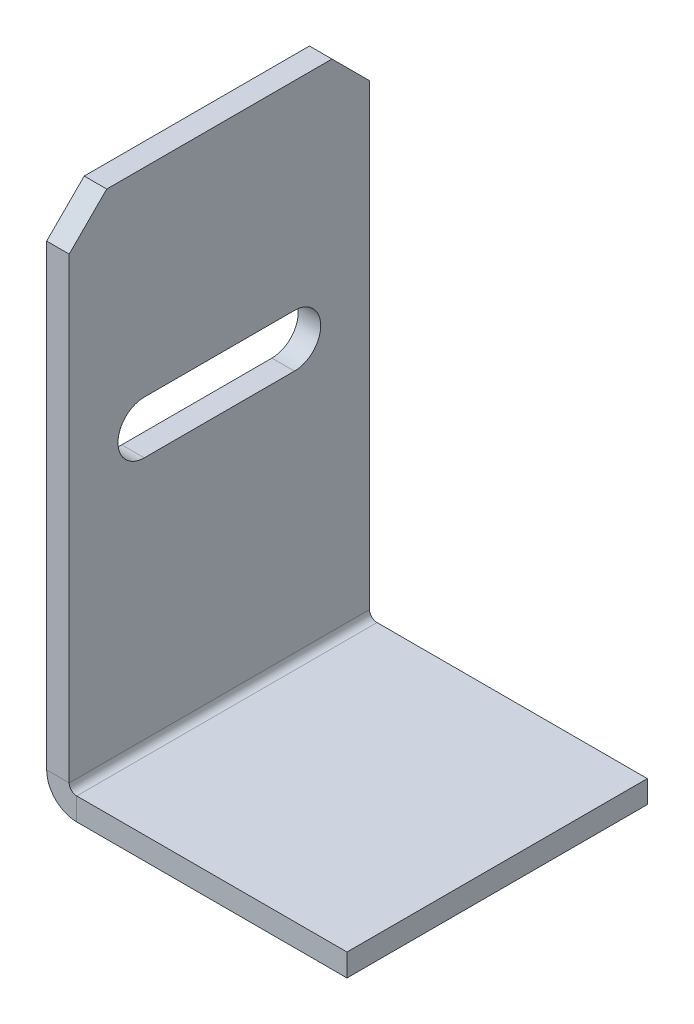
ISO-10303-21;
HEADER;
FILE_DESCRIPTION(('STEP AP214'),'2;1');
FILE_NAME('part.step','',(''),(''),'','','');
FILE_SCHEMA(('AUTOMOTIVE_DESIGN { 1 0 10303 214 1 1 1 1 }'));
ENDSEC;
DATA;
#1=APPLICATION_CONTEXT('core data for automotive mechanical design processes');
#2=APPLICATION_PROTOCOL_DEFINITION('international standard','automotive_design',2000,#1);
#3=PRODUCT_CONTEXT('',#1,'mechanical');
#4=PRODUCT('Part','Part','',(#3));
#5=PRODUCT_RELATED_PRODUCT_CATEGORY('part','',(#4));
#6=PRODUCT_DEFINITION_FORMATION('','',#4);
#7=PRODUCT_DEFINITION_CONTEXT('part definition',#1,'design');
#8=PRODUCT_DEFINITION('design','',#6,#7);
#9=PRODUCT_DEFINITION_SHAPE('','',#8);
#10=(LENGTH_UNIT() NAMED_UNIT(*) SI_UNIT(.MILLI.,.METRE.));
#11=(NAMED_UNIT(*) PLANE_ANGLE_UNIT() SI_UNIT($,.RADIAN.));
#12=(NAMED_UNIT(*) SI_UNIT($,.STERADIAN.) SOLID_ANGLE_UNIT());
#13=UNCERTAINTY_MEASURE_WITH_UNIT(LENGTH_MEASURE(1.E-05),#10,'distance_accuracy_value','');
#14=(GEOMETRIC_REPRESENTATION_CONTEXT(3) GLOBAL_UNCERTAINTY_ASSIGNED_CONTEXT((#13)) GLOBAL_UNIT_ASSIGNED_CONTEXT((#10,
#11,#12)) REPRESENTATION_CONTEXT('',''));
#15=CARTESIAN_POINT('',(0.,0.,0.));
#16=DIRECTION('',(0.,0.,1.));
#17=DIRECTION('',(1.,0.,0.));
#18=AXIS2_PLACEMENT_3D('',#15,#16,#17);
#19=CARTESIAN_POINT('',(0.,0.,40.));
#20=DIRECTION('',(0.,1.,0.));
#21=DIRECTION('',(0.,0.,1.));
#22=AXIS2_PLACEMENT_3D('',#19,#20,#21);
#23=PLANE('',#22);
#24=DIRECTION('',(0.,0.,1.));
#25=VECTOR('',#24,1.);
#26=CARTESIAN_POINT('',(40.,0.,40.));
#27=LINE('',#26,#25);
#28=CARTESIAN_POINT('',(40.,0.,40.));
#29=VERTEX_POINT('',#28);
#30=CARTESIAN_POINT('',(40.,0.,0.));
#31=VERTEX_POINT('',#30);
#32=EDGE_CURVE('E204',#29,#31,#27,.F.);
#33=ORIENTED_EDGE('',*,*,#32,.F.);
#34=DIRECTION('',(1.,0.,0.));
#35=VECTOR('',#34,1.);
#36=CARTESIAN_POINT('',(0.,0.,40.));
#37=LINE('',#36,#35);
#38=CARTESIAN_POINT('',(4.,0.,40.));
#39=VERTEX_POINT('',#38);
#40=EDGE_CURVE('E187',#39,#29,#37,.T.);
#41=ORIENTED_EDGE('',*,*,#40,.F.);
#42=DIRECTION('',(0.,0.,-1.));
#43=VECTOR('',#42,1.);
#44=CARTESIAN_POINT('',(4.,0.,40.));
#45=LINE('',#44,#43);
#46=CARTESIAN_POINT('',(4.,0.,0.));
#47=VERTEX_POINT('',#46);
#48=EDGE_CURVE('E201',#47,#39,#45,.F.);
#49=ORIENTED_EDGE('',*,*,#48,.F.);
#50=DIRECTION('',(1.,0.,0.));
#51=VECTOR('',#50,1.);
#52=CARTESIAN_POINT('',(0.,0.,0.));
#53=LINE('',#52,#51);
#54=EDGE_CURVE('E215',#31,#47,#53,.F.);
#55=ORIENTED_EDGE('',*,*,#54,.F.);
#56=EDGE_LOOP('',(#33,#41,#49,#55));
#57=FACE_BOUND('',#56,.T.);
#58=ADVANCED_FACE('F55',(#57),#23,.F.);
#59=CARTESIAN_POINT('',(4.,110.62899237659,40.));
#60=DIRECTION('',(0.,0.,1.));
#61=DIRECTION('',(0.,1.,0.));
#62=AXIS2_PLACEMENT_3D('',#59,#60,#61);
#63=PLANE('',#62);
#64=ORIENTED_EDGE('',*,*,#40,.T.);
#65=DIRECTION('',(0.,-1.,0.));
#66=VECTOR('',#65,1.);
#67=CARTESIAN_POINT('',(40.,110.62899237659,40.));
#68=LINE('',#67,#66);
#69=CARTESIAN_POINT('',(40.,3.,40.));
#70=VERTEX_POINT('',#69);
#71=EDGE_CURVE('E12',#70,#29,#68,.T.);
#72=ORIENTED_EDGE('',*,*,#71,.F.);
#73=DIRECTION('',(1.,0.,0.));
#74=VECTOR('',#73,1.);
#75=CARTESIAN_POINT('',(4.,3.,40.));
#76=LINE('',#75,#74);
#77=CARTESIAN_POINT('',(4.,3.,40.));
#78=VERTEX_POINT('',#77);
#79=EDGE_CURVE('E189',#70,#78,#76,.F.);
#80=ORIENTED_EDGE('',*,*,#79,.T.);
#81=DIRECTION('',(0.,-1.,0.));
#82=VECTOR('',#81,1.);
#83=CARTESIAN_POINT('',(4.,110.62899237659,40.));
#84=LINE('',#83,#82);
#85=EDGE_CURVE('E185',#78,#39,#84,.T.);
#86=ORIENTED_EDGE('',*,*,#85,.T.);
#87=EDGE_LOOP('',(#64,#72,#80,#86));
#88=FACE_BOUND('',#87,.T.);
#89=ADVANCED_FACE('F57',(#88),#63,.T.);
#90=CARTESIAN_POINT('',(40.,110.62899237659,40.));
#91=DIRECTION('',(1.,0.,0.));
#92=DIRECTION('',(0.,1.,0.));
#93=AXIS2_PLACEMENT_3D('',#90,#91,#92);
#94=PLANE('',#93);
#95=ORIENTED_EDGE('',*,*,#32,.T.);
#96=DIRECTION('',(0.,-1.,0.));
#97=VECTOR('',#96,1.);
#98=CARTESIAN_POINT('',(40.,110.62899237659,0.));
#99=LINE('',#98,#97);
#100=CARTESIAN_POINT('',(40.,3.,0.));
#101=VERTEX_POINT('',#100);
#102=EDGE_CURVE('E64',#101,#31,#99,.T.);
#103=ORIENTED_EDGE('',*,*,#102,.F.);
#104=DIRECTION('',(0.,0.,-1.));
#105=VECTOR('',#104,1.);
#106=CARTESIAN_POINT('',(40.,3.,40.));
#107=LINE('',#106,#105);
#108=EDGE_CURVE('E74',#101,#70,#107,.F.);
#109=ORIENTED_EDGE('',*,*,#108,.T.);
#110=ORIENTED_EDGE('',*,*,#71,.T.);
#111=EDGE_LOOP('',(#95,#103,#109,#110));
#112=FACE_BOUND('',#111,.T.);
#113=ADVANCED_FACE('F265',(#112),#94,.T.);
#114=CARTESIAN_POINT('',(3.,110.62899237659,0.));
#115=DIRECTION('',(0.,0.,-1.));
#116=DIRECTION('',(0.,-1.,0.));
#117=AXIS2_PLACEMENT_3D('',#114,#115,#116);
#118=PLANE('',#117);
#119=ORIENTED_EDGE('',*,*,#54,.T.);
#120=DIRECTION('',(0.,-1.,0.));
#121=VECTOR('',#120,1.);
#122=CARTESIAN_POINT('',(4.,110.62899237659,0.));
#123=LINE('',#122,#121);
#124=CARTESIAN_POINT('',(4.,3.,0.));
#125=VERTEX_POINT('',#124);
#126=EDGE_CURVE('E195',#125,#47,#123,.T.);
#127=ORIENTED_EDGE('',*,*,#126,.F.);
#128=DIRECTION('',(-1.,0.,0.));
#129=VECTOR('',#128,1.);
#130=CARTESIAN_POINT('',(3.,3.,0.));
#131=LINE('',#130,#129);
#132=EDGE_CURVE('E84',#125,#101,#131,.F.);
#133=ORIENTED_EDGE('',*,*,#132,.T.);
#134=ORIENTED_EDGE('',*,*,#102,.T.);
#135=EDGE_LOOP('',(#119,#127,#133,#134));
#136=FACE_BOUND('',#135,.T.);
#137=ADVANCED_FACE('F264',(#136),#118,.T.);
#138=CARTESIAN_POINT('',(0.,3.,40.));
#139=DIRECTION('',(0.,1.,0.));
#140=DIRECTION('',(0.,0.,1.));
#141=AXIS2_PLACEMENT_3D('',#138,#139,#140);
#142=PLANE('',#141);
#143=ORIENTED_EDGE('',*,*,#79,.F.);
#144=ORIENTED_EDGE('',*,*,#108,.F.);
#145=ORIENTED_EDGE('',*,*,#132,.F.);
#146=DIRECTION('',(0.,0.,-1.));
#147=VECTOR('',#146,1.);
#148=CARTESIAN_POINT('',(4.,3.,40.));
#149=LINE('',#148,#147);
#150=EDGE_CURVE('E196',#125,#78,#149,.F.);
#151=ORIENTED_EDGE('',*,*,#150,.T.);
#152=EDGE_LOOP('',(#143,#144,#145,#151));
#153=FACE_BOUND('',#152,.T.);
#154=ADVANCED_FACE('F267',(#153),#142,.T.);
#155=CARTESIAN_POINT('',(-0.00100000000000013,43.5,30.));
#156=DIRECTION('',(0.,1.,0.));
#157=DIRECTION('',(0.,0.,1.));
#158=AXIS2_PLACEMENT_3D('',#155,#156,#157);
#159=PLANE('',#158);
#160=DIRECTION('',(1.,0.,0.));
#161=VECTOR('',#160,1.);
#162=CARTESIAN_POINT('',(-0.00100000000000013,43.5,10.));
#163=LINE('',#162,#161);
#164=CARTESIAN_POINT('',(3.,43.5,9.99999999999999));
#165=VERTEX_POINT('',#164);
#166=CARTESIAN_POINT('',(0.,43.5,10.));
#167=VERTEX_POINT('',#166);
#168=EDGE_CURVE('E327',#165,#167,#163,.F.);
#169=ORIENTED_EDGE('',*,*,#168,.F.);
#170=DIRECTION('',(0.,0.,1.));
#171=VECTOR('',#170,1.);
#172=CARTESIAN_POINT('',(3.,43.5,30.));
#173=LINE('',#172,#171);
#174=CARTESIAN_POINT('',(3.,43.5,30.));
#175=VERTEX_POINT('',#174);
#176=EDGE_CURVE('E283',#175,#165,#173,.F.);
#177=ORIENTED_EDGE('',*,*,#176,.F.);
#178=DIRECTION('',(1.,0.,0.));
#179=VECTOR('',#178,1.);
#180=CARTESIAN_POINT('',(-0.00100000000000013,43.5,30.));
#181=LINE('',#180,#179);
#182=CARTESIAN_POINT('',(0.,43.5,30.));
#183=VERTEX_POINT('',#182);
#184=EDGE_CURVE('E348',#183,#175,#181,.T.);
#185=ORIENTED_EDGE('',*,*,#184,.F.);
#186=DIRECTION('',(0.,0.,-1.));
#187=VECTOR('',#186,1.);
#188=CARTESIAN_POINT('',(0.,43.5,40.));
#189=LINE('',#188,#187);
#190=EDGE_CURVE('E241',#183,#167,#189,.T.);
#191=ORIENTED_EDGE('',*,*,#190,.T.);
#192=EDGE_LOOP('',(#169,#177,#185,#191));
#193=FACE_BOUND('',#192,.T.);
#194=ADVANCED_FACE('F359',(#193),#159,.F.);
#195=CARTESIAN_POINT('',(-0.00100000000000013,40.,30.));
#196=DIRECTION('',(1.,0.,0.));
#197=DIRECTION('',(0.,0.,-1.));
#198=AXIS2_PLACEMENT_3D('',#195,#196,#197);
#199=CYLINDRICAL_SURFACE('',#198,3.5);
#200=ORIENTED_EDGE('',*,*,#184,.T.);
#201=CARTESIAN_POINT('',(3.,40.,30.));
#202=DIRECTION('',(1.,0.,0.));
#203=DIRECTION('',(0.,0.,-1.));
#204=AXIS2_PLACEMENT_3D('',#201,#202,#203);
#205=CIRCLE('',#204,3.5);
#206=CARTESIAN_POINT('',(3.,36.5,30.));
#207=VERTEX_POINT('',#206);
#208=EDGE_CURVE('E291',#207,#175,#205,.F.);
#209=ORIENTED_EDGE('',*,*,#208,.F.);
#210=DIRECTION('',(1.,0.,0.));
#211=VECTOR('',#210,1.);
#212=CARTESIAN_POINT('',(-0.00100000000000013,36.5,30.));
#213=LINE('',#212,#211);
#214=CARTESIAN_POINT('',(0.,36.5,30.));
#215=VERTEX_POINT('',#214);
#216=EDGE_CURVE('E342',#215,#207,#213,.T.);
#217=ORIENTED_EDGE('',*,*,#216,.F.);
#218=CARTESIAN_POINT('',(0.,40.,30.));
#219=DIRECTION('',(1.,0.,0.));
#220=DIRECTION('',(0.,0.,-1.));
#221=AXIS2_PLACEMENT_3D('',#218,#219,#220);
#222=CIRCLE('',#221,3.5);
#223=EDGE_CURVE('E346',#215,#183,#222,.F.);
#224=ORIENTED_EDGE('',*,*,#223,.T.);
#225=EDGE_LOOP('',(#200,#209,#217,#224));
#226=FACE_BOUND('',#225,.T.);
#227=ADVANCED_FACE('F372',(#226),#199,.F.);
#228=CARTESIAN_POINT('',(-0.00100000000000013,36.5,30.));
#229=DIRECTION('',(0.,-1.,0.));
#230=DIRECTION('',(0.,0.,-1.));
#231=AXIS2_PLACEMENT_3D('',#228,#229,#230);
#232=PLANE('',#231);
#233=ORIENTED_EDGE('',*,*,#216,.T.);
#234=DIRECTION('',(0.,0.,-1.));
#235=VECTOR('',#234,1.);
#236=CARTESIAN_POINT('',(3.,36.5,30.));
#237=LINE('',#236,#235);
#238=CARTESIAN_POINT('',(3.,36.5,9.99999999999999));
#239=VERTEX_POINT('',#238);
#240=EDGE_CURVE('E298',#239,#207,#237,.F.);
#241=ORIENTED_EDGE('',*,*,#240,.F.);
#242=DIRECTION('',(1.,0.,0.));
#243=VECTOR('',#242,1.);
#244=CARTESIAN_POINT('',(-0.00100000000000013,36.5,9.99999999999999));
#245=LINE('',#244,#243);
#246=CARTESIAN_POINT('',(0.,36.5,9.99999999999999));
#247=VERTEX_POINT('',#246);
#248=EDGE_CURVE('E331',#247,#239,#245,.T.);
#249=ORIENTED_EDGE('',*,*,#248,.F.);
#250=DIRECTION('',(0.,0.,-1.));
#251=VECTOR('',#250,1.);
#252=CARTESIAN_POINT('',(0.,36.5,40.));
#253=LINE('',#252,#251);
#254=EDGE_CURVE('E338',#247,#215,#253,.F.);
#255=ORIENTED_EDGE('',*,*,#254,.T.);
#256=EDGE_LOOP('',(#233,#241,#249,#255));
#257=FACE_BOUND('',#256,.T.);
#258=ADVANCED_FACE('F374',(#257),#232,.F.);
#259=CARTESIAN_POINT('',(-0.00100000000000013,40.,9.99999999999999));
#260=DIRECTION('',(1.,0.,0.));
#261=DIRECTION('',(0.,0.,-1.));
#262=AXIS2_PLACEMENT_3D('',#259,#260,#261);
#263=CYLINDRICAL_SURFACE('',#262,3.5);
#264=CARTESIAN_POINT('',(0.,40.,9.99999999999999));
#265=DIRECTION('',(1.,0.,0.));
#266=DIRECTION('',(0.,0.,-1.));
#267=AXIS2_PLACEMENT_3D('',#264,#265,#266);
#268=CIRCLE('',#267,3.5);
#269=EDGE_CURVE('E335',#167,#247,#268,.F.);
#270=ORIENTED_EDGE('',*,*,#269,.T.);
#271=ORIENTED_EDGE('',*,*,#248,.T.);
#272=CARTESIAN_POINT('',(3.,40.,9.99999999999999));
#273=DIRECTION('',(1.,0.,0.));
#274=DIRECTION('',(0.,0.,-1.));
#275=AXIS2_PLACEMENT_3D('',#272,#273,#274);
#276=CIRCLE('',#275,3.5);
#277=EDGE_CURVE('E301',#165,#239,#276,.F.);
#278=ORIENTED_EDGE('',*,*,#277,.F.);
#279=ORIENTED_EDGE('',*,*,#168,.T.);
#280=EDGE_LOOP('',(#270,#271,#278,#279));
#281=FACE_BOUND('',#280,.T.);
#282=ADVANCED_FACE('F367',(#281),#263,.F.);
#283=CARTESIAN_POINT('',(157.350251052598,70.,35.));
#284=DIRECTION('',(0.,-0.707106781186546,-0.707106781186549));
#285=DIRECTION('',(0.,0.707106781186549,-0.707106781186546));
#286=AXIS2_PLACEMENT_3D('',#283,#284,#285);
#287=PLANE('',#286);
#288=DIRECTION('',(-1.,0.,0.));
#289=VECTOR('',#288,1.);
#290=CARTESIAN_POINT('',(157.350251052598,70.,35.));
#291=LINE('',#290,#289);
#292=CARTESIAN_POINT('',(3.,70.,35.));
#293=VERTEX_POINT('',#292);
#294=CARTESIAN_POINT('',(0.,70.,35.));
#295=VERTEX_POINT('',#294);
#296=EDGE_CURVE('E322',#293,#295,#291,.T.);
#297=ORIENTED_EDGE('',*,*,#296,.T.);
#298=DIRECTION('',(0.,-0.707106781186549,0.707106781186545));
#299=VECTOR('',#298,1.);
#300=CARTESIAN_POINT('',(0.,70.,35.));
#301=LINE('',#300,#299);
#302=CARTESIAN_POINT('',(0.,65.,40.));
#303=VERTEX_POINT('',#302);
#304=EDGE_CURVE('E315',#295,#303,#301,.T.);
#305=ORIENTED_EDGE('',*,*,#304,.T.);
#306=DIRECTION('',(-1.,0.,0.));
#307=VECTOR('',#306,1.);
#308=CARTESIAN_POINT('',(157.350251052598,65.,40.));
#309=LINE('',#308,#307);
#310=CARTESIAN_POINT('',(3.,65.,40.));
#311=VERTEX_POINT('',#310);
#312=EDGE_CURVE('E247',#311,#303,#309,.T.);
#313=ORIENTED_EDGE('',*,*,#312,.F.);
#314=DIRECTION('',(0.,0.707106781186549,-0.707106781186546));
#315=VECTOR('',#314,1.);
#316=CARTESIAN_POINT('',(3.,70.,35.));
#317=LINE('',#316,#315);
#318=EDGE_CURVE('E309',#293,#311,#317,.F.);
#319=ORIENTED_EDGE('',*,*,#318,.F.);
#320=EDGE_LOOP('',(#297,#305,#313,#319));
#321=FACE_BOUND('',#320,.T.);
#322=ADVANCED_FACE('F381',(#321),#287,.F.);
#323=CARTESIAN_POINT('',(157.350251052598,70.,40.));
#324=DIRECTION('',(0.,1.,0.));
#325=DIRECTION('',(0.,0.,1.));
#326=AXIS2_PLACEMENT_3D('',#323,#324,#325);
#327=PLANE('',#326);
#328=DIRECTION('',(0.,0.,-1.));
#329=VECTOR('',#328,1.);
#330=CARTESIAN_POINT('',(0.,70.,40.));
#331=LINE('',#330,#329);
#332=CARTESIAN_POINT('',(0.,70.,5.));
#333=VERTEX_POINT('',#332);
#334=EDGE_CURVE('E321',#333,#295,#331,.F.);
#335=ORIENTED_EDGE('',*,*,#334,.T.);
#336=ORIENTED_EDGE('',*,*,#296,.F.);
#337=DIRECTION('',(0.,0.,1.));
#338=VECTOR('',#337,1.);
#339=CARTESIAN_POINT('',(3.,70.,40.));
#340=LINE('',#339,#338);
#341=CARTESIAN_POINT('',(3.,70.,5.));
#342=VERTEX_POINT('',#341);
#343=EDGE_CURVE('E638',#293,#342,#340,.F.);
#344=ORIENTED_EDGE('',*,*,#343,.T.);
#345=DIRECTION('',(-1.,0.,0.));
#346=VECTOR('',#345,1.);
#347=CARTESIAN_POINT('',(157.350251052598,70.,5.));
#348=LINE('',#347,#346);
#349=EDGE_CURVE('E634',#342,#333,#348,.T.);
#350=ORIENTED_EDGE('',*,*,#349,.T.);
#351=EDGE_LOOP('',(#335,#336,#344,#350));
#352=FACE_BOUND('',#351,.T.);
#353=ADVANCED_FACE('F446',(#352),#327,.T.);
#354=CARTESIAN_POINT('',(157.350251052598,65.,0.));
#355=DIRECTION('',(0.,0.707106781186549,-0.707106781186546));
#356=DIRECTION('',(0.,0.707106781186546,0.707106781186549));
#357=AXIS2_PLACEMENT_3D('',#354,#355,#356);
#358=PLANE('',#357);
#359=DIRECTION('',(0.,0.707106781186546,0.707106781186548));
#360=VECTOR('',#359,1.);
#361=CARTESIAN_POINT('',(0.,65.,0.));
#362=LINE('',#361,#360);
#363=CARTESIAN_POINT('',(0.,65.,0.));
#364=VERTEX_POINT('',#363);
#365=EDGE_CURVE('E627',#364,#333,#362,.T.);
#366=ORIENTED_EDGE('',*,*,#365,.T.);
#367=ORIENTED_EDGE('',*,*,#349,.F.);
#368=DIRECTION('',(0.,0.707106781186546,0.707106781186549));
#369=VECTOR('',#368,1.);
#370=CARTESIAN_POINT('',(3.,65.,0.));
#371=LINE('',#370,#369);
#372=CARTESIAN_POINT('',(3.,65.,0.));
#373=VERTEX_POINT('',#372);
#374=EDGE_CURVE('E633',#342,#373,#371,.F.);
#375=ORIENTED_EDGE('',*,*,#374,.T.);
#376=DIRECTION('',(-1.,0.,0.));
#377=VECTOR('',#376,1.);
#378=CARTESIAN_POINT('',(157.350251052598,65.,0.));
#379=LINE('',#378,#377);
#380=EDGE_CURVE('E651',#373,#364,#379,.T.);
#381=ORIENTED_EDGE('',*,*,#380,.T.);
#382=EDGE_LOOP('',(#366,#367,#375,#381));
#383=FACE_BOUND('',#382,.T.);
#384=ADVANCED_FACE('F456',(#383),#358,.T.);
#385=CARTESIAN_POINT('',(3.,0.,40.));
#386=DIRECTION('',(1.,0.,0.));
#387=DIRECTION('',(0.,0.,-1.));
#388=AXIS2_PLACEMENT_3D('',#385,#386,#387);
#389=PLANE('',#388);
#390=DIRECTION('',(0.,1.,0.));
#391=VECTOR('',#390,1.);
#392=CARTESIAN_POINT('',(3.,4.,0.));
#393=LINE('',#392,#391);
#394=CARTESIAN_POINT('',(3.,4.,0.));
#395=VERTEX_POINT('',#394);
#396=EDGE_CURVE('E647',#395,#373,#393,.T.);
#397=ORIENTED_EDGE('',*,*,#396,.T.);
#398=ORIENTED_EDGE('',*,*,#374,.F.);
#399=ORIENTED_EDGE('',*,*,#343,.F.);
#400=ORIENTED_EDGE('',*,*,#318,.T.);
#401=DIRECTION('',(0.,1.,0.));
#402=VECTOR('',#401,1.);
#403=CARTESIAN_POINT('',(3.,3.,40.));
#404=LINE('',#403,#402);
#405=CARTESIAN_POINT('',(3.,4.,40.));
#406=VERTEX_POINT('',#405);
#407=EDGE_CURVE('E619',#406,#311,#404,.T.);
#408=ORIENTED_EDGE('',*,*,#407,.F.);
#409=DIRECTION('',(0.,0.,-1.));
#410=VECTOR('',#409,1.);
#411=CARTESIAN_POINT('',(3.,4.,40.));
#412=LINE('',#411,#410);
#413=EDGE_CURVE('E304',#406,#395,#412,.T.);
#414=ORIENTED_EDGE('',*,*,#413,.T.);
#415=EDGE_LOOP('',(#397,#398,#399,#400,#408,#414));
#416=FACE_BOUND('',#415,.T.);
#417=ORIENTED_EDGE('',*,*,#277,.T.);
#418=ORIENTED_EDGE('',*,*,#240,.T.);
#419=ORIENTED_EDGE('',*,*,#208,.T.);
#420=ORIENTED_EDGE('',*,*,#176,.T.);
#421=EDGE_LOOP('',(#417,#418,#419,#420));
#422=FACE_BOUND('',#421,.T.);
#423=ADVANCED_FACE('F370',(#416,#422),#389,.T.);
#424=CARTESIAN_POINT('',(157.350251052598,4.,0.));
#425=DIRECTION('',(0.,0.,1.));
#426=DIRECTION('',(1.,0.,0.));
#427=AXIS2_PLACEMENT_3D('',#424,#425,#426);
#428=PLANE('',#427);
#429=DIRECTION('',(-1.,0.,0.));
#430=VECTOR('',#429,1.);
#431=CARTESIAN_POINT('',(157.350251052598,4.,0.));
#432=LINE('',#431,#430);
#433=CARTESIAN_POINT('',(0.,4.,0.));
#434=VERTEX_POINT('',#433);
#435=EDGE_CURVE('E277',#395,#434,#432,.T.);
#436=ORIENTED_EDGE('',*,*,#435,.T.);
#437=DIRECTION('',(0.,1.,0.));
#438=VECTOR('',#437,1.);
#439=CARTESIAN_POINT('',(0.,0.,0.));
#440=LINE('',#439,#438);
#441=EDGE_CURVE('E282',#434,#364,#440,.T.);
#442=ORIENTED_EDGE('',*,*,#441,.T.);
#443=ORIENTED_EDGE('',*,*,#380,.F.);
#444=ORIENTED_EDGE('',*,*,#396,.F.);
#445=EDGE_LOOP('',(#436,#442,#443,#444));
#446=FACE_BOUND('',#445,.T.);
#447=ADVANCED_FACE('F475',(#446),#428,.F.);
#448=CARTESIAN_POINT('',(0.,0.,40.));
#449=DIRECTION('',(1.,0.,0.));
#450=DIRECTION('',(0.,0.,-1.));
#451=AXIS2_PLACEMENT_3D('',#448,#449,#450);
#452=PLANE('',#451);
#453=ORIENTED_EDGE('',*,*,#304,.F.);
#454=ORIENTED_EDGE('',*,*,#334,.F.);
#455=ORIENTED_EDGE('',*,*,#365,.F.);
#456=ORIENTED_EDGE('',*,*,#441,.F.);
#457=DIRECTION('',(0.,0.,-1.));
#458=VECTOR('',#457,1.);
#459=CARTESIAN_POINT('',(0.,4.,40.));
#460=LINE('',#459,#458);
#461=CARTESIAN_POINT('',(0.,4.,40.));
#462=VERTEX_POINT('',#461);
#463=EDGE_CURVE('E236',#462,#434,#460,.T.);
#464=ORIENTED_EDGE('',*,*,#463,.F.);
#465=DIRECTION('',(0.,1.,0.));
#466=VECTOR('',#465,1.);
#467=CARTESIAN_POINT('',(0.,0.,40.));
#468=LINE('',#467,#466);
#469=EDGE_CURVE('E288',#303,#462,#468,.F.);
#470=ORIENTED_EDGE('',*,*,#469,.F.);
#471=EDGE_LOOP('',(#453,#454,#455,#456,#464,#470));
#472=FACE_BOUND('',#471,.T.);
#473=ORIENTED_EDGE('',*,*,#223,.F.);
#474=ORIENTED_EDGE('',*,*,#254,.F.);
#475=ORIENTED_EDGE('',*,*,#269,.F.);
#476=ORIENTED_EDGE('',*,*,#190,.F.);
#477=EDGE_LOOP('',(#473,#474,#475,#476));
#478=FACE_BOUND('',#477,.T.);
#479=ADVANCED_FACE('F363',(#472,#478),#452,.F.);
#480=CARTESIAN_POINT('',(157.350251052598,3.,40.));
#481=DIRECTION('',(0.,0.,1.));
#482=DIRECTION('',(1.,0.,0.));
#483=AXIS2_PLACEMENT_3D('',#480,#481,#482);
#484=PLANE('',#483);
#485=ORIENTED_EDGE('',*,*,#469,.T.);
#486=DIRECTION('',(-1.,0.,0.));
#487=VECTOR('',#486,1.);
#488=CARTESIAN_POINT('',(157.350251052598,4.,40.));
#489=LINE('',#488,#487);
#490=EDGE_CURVE('E219',#406,#462,#489,.T.);
#491=ORIENTED_EDGE('',*,*,#490,.F.);
#492=ORIENTED_EDGE('',*,*,#407,.T.);
#493=ORIENTED_EDGE('',*,*,#312,.T.);
#494=EDGE_LOOP('',(#485,#491,#492,#493));
#495=FACE_BOUND('',#494,.T.);
#496=ADVANCED_FACE('F393',(#495),#484,.T.);
#497=CARTESIAN_POINT('',(4.,4.,0.));
#498=DIRECTION('',(0.,0.,-1.));
#499=DIRECTION('',(-1.,0.,0.));
#500=AXIS2_PLACEMENT_3D('',#497,#498,#499);
#501=PLANE('',#500);
#502=ORIENTED_EDGE('',*,*,#435,.F.);
#503=CARTESIAN_POINT('',(4.,4.,0.));
#504=DIRECTION('',(0.,0.,-1.));
#505=DIRECTION('',(-1.,0.,0.));
#506=AXIS2_PLACEMENT_3D('',#503,#504,#505);
#507=CIRCLE('',#506,1.);
#508=EDGE_CURVE('E221',#395,#125,#507,.F.);
#509=ORIENTED_EDGE('',*,*,#508,.T.);
#510=ORIENTED_EDGE('',*,*,#126,.T.);
#511=CARTESIAN_POINT('',(4.,4.,0.));
#512=DIRECTION('',(0.,0.,-1.));
#513=DIRECTION('',(-1.,0.,0.));
#514=AXIS2_PLACEMENT_3D('',#511,#512,#513);
#515=CIRCLE('',#514,4.);
#516=EDGE_CURVE('E213',#434,#47,#515,.F.);
#517=ORIENTED_EDGE('',*,*,#516,.F.);
#518=EDGE_LOOP('',(#502,#509,#510,#517));
#519=FACE_BOUND('',#518,.T.);
#520=ADVANCED_FACE('F275',(#519),#501,.T.);
#521=CARTESIAN_POINT('',(4.,4.,40.));
#522=DIRECTION('',(0.,0.,1.));
#523=DIRECTION('',(1.,0.,0.));
#524=AXIS2_PLACEMENT_3D('',#521,#522,#523);
#525=PLANE('',#524);
#526=ORIENTED_EDGE('',*,*,#85,.F.);
#527=CARTESIAN_POINT('',(4.,4.,40.));
#528=DIRECTION('',(0.,0.,-1.));
#529=DIRECTION('',(-1.,0.,0.));
#530=AXIS2_PLACEMENT_3D('',#527,#528,#529);
#531=CIRCLE('',#530,1.);
#532=EDGE_CURVE('E227',#78,#406,#531,.T.);
#533=ORIENTED_EDGE('',*,*,#532,.T.);
#534=ORIENTED_EDGE('',*,*,#490,.T.);
#535=CARTESIAN_POINT('',(4.,4.,40.));
#536=DIRECTION('',(0.,0.,-1.));
#537=DIRECTION('',(-1.,0.,0.));
#538=AXIS2_PLACEMENT_3D('',#535,#536,#537);
#539=CIRCLE('',#538,4.);
#540=EDGE_CURVE('E210',#39,#462,#539,.T.);
#541=ORIENTED_EDGE('',*,*,#540,.F.);
#542=EDGE_LOOP('',(#526,#533,#534,#541));
#543=FACE_BOUND('',#542,.T.);
#544=ADVANCED_FACE('F217',(#543),#525,.T.);
#545=CARTESIAN_POINT('',(4.,4.,152.027496624713));
#546=DIRECTION('',(0.,0.,-1.));
#547=DIRECTION('',(-1.,0.,0.));
#548=AXIS2_PLACEMENT_3D('',#545,#546,#547);
#549=CYLINDRICAL_SURFACE('',#548,4.);
#550=ORIENTED_EDGE('',*,*,#540,.T.);
#551=ORIENTED_EDGE('',*,*,#463,.T.);
#552=ORIENTED_EDGE('',*,*,#516,.T.);
#553=ORIENTED_EDGE('',*,*,#48,.T.);
#554=EDGE_LOOP('',(#550,#551,#552,#553));
#555=FACE_BOUND('',#554,.T.);
#556=ADVANCED_FACE('F209',(#555),#549,.T.);
#557=CARTESIAN_POINT('',(4.,4.,152.027496624713));
#558=DIRECTION('',(0.,0.,-1.));
#559=DIRECTION('',(-1.,0.,0.));
#560=AXIS2_PLACEMENT_3D('',#557,#558,#559);
#561=CYLINDRICAL_SURFACE('',#560,1.);
#562=ORIENTED_EDGE('',*,*,#532,.F.);
#563=ORIENTED_EDGE('',*,*,#150,.F.);
#564=ORIENTED_EDGE('',*,*,#508,.F.);
#565=ORIENTED_EDGE('',*,*,#413,.F.);
#566=EDGE_LOOP('',(#562,#563,#564,#565));
#567=FACE_BOUND('',#566,.T.);
#568=ADVANCED_FACE('F271',(#567),#561,.F.);
#569=CLOSED_SHELL('',(#58,#89,#113,#137,#154,#194,#227,#258,#282,#322,#353,#384,#423,#447,#479,
#496,#520,#544,#556,#568));
#570=MANIFOLD_SOLID_BREP('B2',#569);
#571=ADVANCED_BREP_SHAPE_REPRESENTATION('',(#18,#570),#14);
#572=SHAPE_DEFINITION_REPRESENTATION(#9,#571);
ENDSEC;
END-ISO-10303-21;
